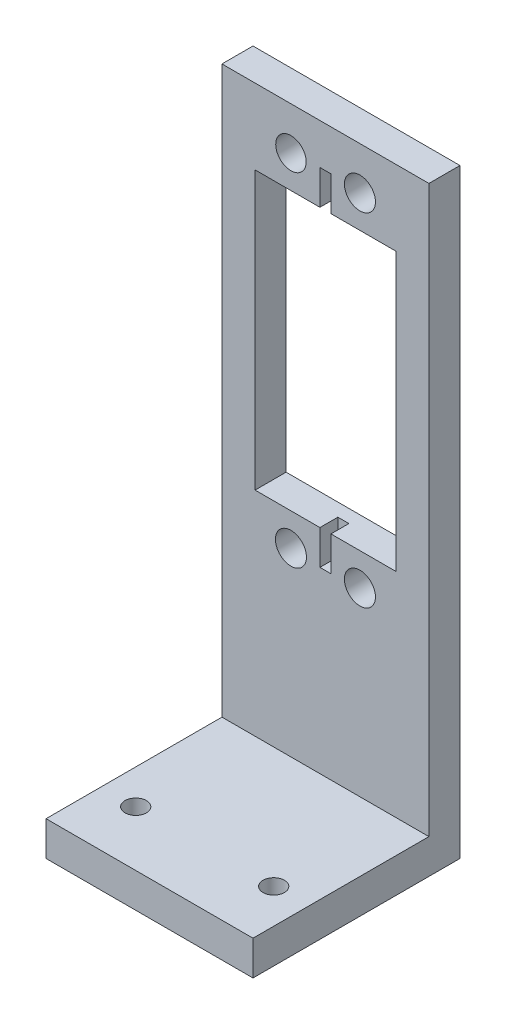
ISO-10303-21;
HEADER;
FILE_DESCRIPTION(('STEP AP214'),'2;1');
FILE_NAME('part.step','',(''),(''),'','','');
FILE_SCHEMA(('AUTOMOTIVE_DESIGN { 1 0 10303 214 1 1 1 1 }'));
ENDSEC;
DATA;
#1=APPLICATION_CONTEXT('core data for automotive mechanical design processes');
#2=APPLICATION_PROTOCOL_DEFINITION('international standard','automotive_design',2000,#1);
#3=PRODUCT_CONTEXT('',#1,'mechanical');
#4=PRODUCT('Part','Part','',(#3));
#5=PRODUCT_RELATED_PRODUCT_CATEGORY('part','',(#4));
#6=PRODUCT_DEFINITION_FORMATION('','',#4);
#7=PRODUCT_DEFINITION_CONTEXT('part definition',#1,'design');
#8=PRODUCT_DEFINITION('design','',#6,#7);
#9=PRODUCT_DEFINITION_SHAPE('','',#8);
#10=(LENGTH_UNIT() NAMED_UNIT(*) SI_UNIT(.MILLI.,.METRE.));
#11=(NAMED_UNIT(*) PLANE_ANGLE_UNIT() SI_UNIT($,.RADIAN.));
#12=(NAMED_UNIT(*) SI_UNIT($,.STERADIAN.) SOLID_ANGLE_UNIT());
#13=UNCERTAINTY_MEASURE_WITH_UNIT(LENGTH_MEASURE(1.E-05),#10,'distance_accuracy_value','');
#14=(GEOMETRIC_REPRESENTATION_CONTEXT(3) GLOBAL_UNCERTAINTY_ASSIGNED_CONTEXT((#13)) GLOBAL_UNIT_ASSIGNED_CONTEXT((#10,
#11,#12)) REPRESENTATION_CONTEXT('',''));
#15=CARTESIAN_POINT('',(0.,0.,0.));
#16=DIRECTION('',(0.,0.,1.));
#17=DIRECTION('',(1.,0.,0.));
#18=AXIS2_PLACEMENT_3D('',#15,#16,#17);
#19=CARTESIAN_POINT('',(0.,0.,4.5));
#20=DIRECTION('',(0.,0.,1.));
#21=DIRECTION('',(1.,0.,0.));
#22=AXIS2_PLACEMENT_3D('',#19,#20,#21);
#23=PLANE('',#22);
#24=DIRECTION('',(0.,-1.,0.));
#25=VECTOR('',#24,1.);
#26=CARTESIAN_POINT('',(-0.800000000000001,-25.1,4.5));
#27=LINE('',#26,#25);
#28=CARTESIAN_POINT('',(-0.800000000000001,-20.1,4.5));
#29=VERTEX_POINT('',#28);
#30=CARTESIAN_POINT('',(-0.800000000000001,-25.1,4.5));
#31=VERTEX_POINT('',#30);
#32=EDGE_CURVE('E178',#29,#31,#27,.T.);
#33=ORIENTED_EDGE('',*,*,#32,.F.);
#34=DIRECTION('',(1.,0.,0.));
#35=VECTOR('',#34,1.);
#36=CARTESIAN_POINT('',(10.2,-20.1,4.5));
#37=LINE('',#36,#35);
#38=CARTESIAN_POINT('',(-10.2,-20.1,4.5));
#39=VERTEX_POINT('',#38);
#40=EDGE_CURVE('E344',#39,#29,#37,.T.);
#41=ORIENTED_EDGE('',*,*,#40,.F.);
#42=DIRECTION('',(0.,-1.,0.));
#43=VECTOR('',#42,1.);
#44=CARTESIAN_POINT('',(-10.2,-20.1,4.5));
#45=LINE('',#44,#43);
#46=CARTESIAN_POINT('',(-10.2,20.1,4.5));
#47=VERTEX_POINT('',#46);
#48=EDGE_CURVE('E339',#47,#39,#45,.T.);
#49=ORIENTED_EDGE('',*,*,#48,.F.);
#50=DIRECTION('',(-1.,0.,0.));
#51=VECTOR('',#50,1.);
#52=CARTESIAN_POINT('',(10.2,20.1,4.5));
#53=LINE('',#52,#51);
#54=CARTESIAN_POINT('',(-0.800000000000001,20.1,4.5));
#55=VERTEX_POINT('',#54);
#56=EDGE_CURVE('E352',#55,#47,#53,.T.);
#57=ORIENTED_EDGE('',*,*,#56,.F.);
#58=DIRECTION('',(0.,-1.,0.));
#59=VECTOR('',#58,1.);
#60=CARTESIAN_POINT('',(-0.800000000000001,25.1,4.5));
#61=LINE('',#60,#59);
#62=CARTESIAN_POINT('',(-0.800000000000001,25.1,4.5));
#63=VERTEX_POINT('',#62);
#64=EDGE_CURVE('E233',#63,#55,#61,.T.);
#65=ORIENTED_EDGE('',*,*,#64,.F.);
#66=DIRECTION('',(-1.,0.,0.));
#67=VECTOR('',#66,1.);
#68=CARTESIAN_POINT('',(0.799999999999999,25.1,4.5));
#69=LINE('',#68,#67);
#70=CARTESIAN_POINT('',(0.799999999999999,25.1,4.5));
#71=VERTEX_POINT('',#70);
#72=EDGE_CURVE('E236',#71,#63,#69,.T.);
#73=ORIENTED_EDGE('',*,*,#72,.F.);
#74=DIRECTION('',(0.,1.,0.));
#75=VECTOR('',#74,1.);
#76=CARTESIAN_POINT('',(0.799999999999999,25.1,4.5));
#77=LINE('',#76,#75);
#78=CARTESIAN_POINT('',(0.799999999999999,20.1,4.5));
#79=VERTEX_POINT('',#78);
#80=EDGE_CURVE('E206',#79,#71,#77,.T.);
#81=ORIENTED_EDGE('',*,*,#80,.F.);
#82=CARTESIAN_POINT('',(10.2,20.1,4.5));
#83=VERTEX_POINT('',#82);
#84=EDGE_CURVE('E353',#83,#79,#53,.T.);
#85=ORIENTED_EDGE('',*,*,#84,.F.);
#86=DIRECTION('',(0.,1.,0.));
#87=VECTOR('',#86,1.);
#88=CARTESIAN_POINT('',(10.2,-20.1,4.5));
#89=LINE('',#88,#87);
#90=CARTESIAN_POINT('',(10.2,-20.1,4.5));
#91=VERTEX_POINT('',#90);
#92=EDGE_CURVE('E348',#91,#83,#89,.T.);
#93=ORIENTED_EDGE('',*,*,#92,.F.);
#94=CARTESIAN_POINT('',(0.799999999999999,-20.1,4.5));
#95=VERTEX_POINT('',#94);
#96=EDGE_CURVE('E342',#95,#91,#37,.T.);
#97=ORIENTED_EDGE('',*,*,#96,.F.);
#98=DIRECTION('',(0.,1.,0.));
#99=VECTOR('',#98,1.);
#100=CARTESIAN_POINT('',(0.799999999999999,-25.1,4.5));
#101=LINE('',#100,#99);
#102=CARTESIAN_POINT('',(0.799999999999999,-25.1,4.5));
#103=VERTEX_POINT('',#102);
#104=EDGE_CURVE('E194',#103,#95,#101,.T.);
#105=ORIENTED_EDGE('',*,*,#104,.F.);
#106=DIRECTION('',(1.,0.,0.));
#107=VECTOR('',#106,1.);
#108=CARTESIAN_POINT('',(0.799999999999999,-25.1,4.5));
#109=LINE('',#108,#107);
#110=EDGE_CURVE('E197',#31,#103,#109,.T.);
#111=ORIENTED_EDGE('',*,*,#110,.F.);
#112=EDGE_LOOP('',(#33,#41,#49,#57,#65,#73,#81,#85,#93,#97,#105,#111));
#113=FACE_BOUND('',#112,.T.);
#114=CARTESIAN_POINT('',(-5.,-24.8,4.5));
#115=DIRECTION('',(0.,0.,-1.));
#116=DIRECTION('',(-1.,0.,0.));
#117=AXIS2_PLACEMENT_3D('',#114,#115,#116);
#118=CIRCLE('',#117,2.25);
#119=CARTESIAN_POINT('',(-7.25,-24.8,4.5));
#120=VERTEX_POINT('',#119);
#121=EDGE_CURVE('E320',#120,#120,#118,.T.);
#122=ORIENTED_EDGE('',*,*,#121,.T.);
#123=EDGE_LOOP('',(#122));
#124=FACE_BOUND('',#123,.T.);
#125=CARTESIAN_POINT('',(5.,24.8,4.5));
#126=DIRECTION('',(0.,0.,-1.));
#127=DIRECTION('',(-1.,0.,0.));
#128=AXIS2_PLACEMENT_3D('',#125,#126,#127);
#129=CIRCLE('',#128,2.25);
#130=CARTESIAN_POINT('',(2.75,24.8,4.5));
#131=VERTEX_POINT('',#130);
#132=EDGE_CURVE('E311',#131,#131,#129,.T.);
#133=ORIENTED_EDGE('',*,*,#132,.T.);
#134=EDGE_LOOP('',(#133));
#135=FACE_BOUND('',#134,.T.);
#136=CARTESIAN_POINT('',(-5.,24.8,4.5));
#137=DIRECTION('',(0.,0.,-1.));
#138=DIRECTION('',(-1.,0.,0.));
#139=AXIS2_PLACEMENT_3D('',#136,#137,#138);
#140=CIRCLE('',#139,2.20649785974984);
#141=CARTESIAN_POINT('',(-7.20649785974984,24.8,4.5));
#142=VERTEX_POINT('',#141);
#143=EDGE_CURVE('E306',#142,#142,#140,.T.);
#144=ORIENTED_EDGE('',*,*,#143,.T.);
#145=EDGE_LOOP('',(#144));
#146=FACE_BOUND('',#145,.T.);
#147=CARTESIAN_POINT('',(5.,-24.8,4.5));
#148=DIRECTION('',(0.,0.,-1.));
#149=DIRECTION('',(-1.,0.,0.));
#150=AXIS2_PLACEMENT_3D('',#147,#148,#149);
#151=CIRCLE('',#150,2.25);
#152=CARTESIAN_POINT('',(2.75,-24.8,4.5));
#153=VERTEX_POINT('',#152);
#154=EDGE_CURVE('E331',#153,#153,#151,.T.);
#155=ORIENTED_EDGE('',*,*,#154,.T.);
#156=EDGE_LOOP('',(#155));
#157=FACE_BOUND('',#156,.T.);
#158=DIRECTION('',(0.,-1.,0.));
#159=VECTOR('',#158,1.);
#160=CARTESIAN_POINT('',(-15.,-31.,4.5));
#161=LINE('',#160,#159);
#162=CARTESIAN_POINT('',(-15.,31.,4.5));
#163=VERTEX_POINT('',#162);
#164=CARTESIAN_POINT('',(-15.,-51.,4.5));
#165=VERTEX_POINT('',#164);
#166=EDGE_CURVE('E386',#163,#165,#161,.T.);
#167=ORIENTED_EDGE('',*,*,#166,.T.);
#168=DIRECTION('',(-1.,0.,0.));
#169=VECTOR('',#168,1.);
#170=CARTESIAN_POINT('',(15.,-51.,4.5));
#171=LINE('',#170,#169);
#172=CARTESIAN_POINT('',(15.,-51.,4.5));
#173=VERTEX_POINT('',#172);
#174=EDGE_CURVE('E302',#173,#165,#171,.T.);
#175=ORIENTED_EDGE('',*,*,#174,.F.);
#176=DIRECTION('',(0.,1.,0.));
#177=VECTOR('',#176,1.);
#178=CARTESIAN_POINT('',(15.,-31.,4.5));
#179=LINE('',#178,#177);
#180=CARTESIAN_POINT('',(15.,31.,4.5));
#181=VERTEX_POINT('',#180);
#182=EDGE_CURVE('E389',#173,#181,#179,.T.);
#183=ORIENTED_EDGE('',*,*,#182,.T.);
#184=DIRECTION('',(-1.,0.,0.));
#185=VECTOR('',#184,1.);
#186=CARTESIAN_POINT('',(15.,31.,4.5));
#187=LINE('',#186,#185);
#188=EDGE_CURVE('E393',#181,#163,#187,.T.);
#189=ORIENTED_EDGE('',*,*,#188,.T.);
#190=EDGE_LOOP('',(#167,#175,#183,#189));
#191=FACE_BOUND('',#190,.T.);
#192=ADVANCED_FACE('F43',(#113,#124,#135,#146,#157,#191),#23,.T.);
#193=CARTESIAN_POINT('',(0.,0.,0.));
#194=DIRECTION('',(0.,0.,1.));
#195=DIRECTION('',(1.,0.,0.));
#196=AXIS2_PLACEMENT_3D('',#193,#194,#195);
#197=PLANE('',#196);
#198=CARTESIAN_POINT('',(-5.,-24.8,0.));
#199=DIRECTION('',(0.,0.,-1.));
#200=DIRECTION('',(-1.,0.,0.));
#201=AXIS2_PLACEMENT_3D('',#198,#199,#200);
#202=CIRCLE('',#201,2.25);
#203=CARTESIAN_POINT('',(-7.25,-24.8,0.));
#204=VERTEX_POINT('',#203);
#205=EDGE_CURVE('E315',#204,#204,#202,.T.);
#206=ORIENTED_EDGE('',*,*,#205,.F.);
#207=EDGE_LOOP('',(#206));
#208=FACE_BOUND('',#207,.T.);
#209=CARTESIAN_POINT('',(5.,24.8,0.));
#210=DIRECTION('',(0.,0.,-1.));
#211=DIRECTION('',(-1.,0.,0.));
#212=AXIS2_PLACEMENT_3D('',#209,#210,#211);
#213=CIRCLE('',#212,2.25);
#214=CARTESIAN_POINT('',(2.75,24.8,0.));
#215=VERTEX_POINT('',#214);
#216=EDGE_CURVE('E324',#215,#215,#213,.T.);
#217=ORIENTED_EDGE('',*,*,#216,.F.);
#218=EDGE_LOOP('',(#217));
#219=FACE_BOUND('',#218,.T.);
#220=CARTESIAN_POINT('',(-5.,24.8,0.));
#221=DIRECTION('',(0.,0.,-1.));
#222=DIRECTION('',(-1.,0.,0.));
#223=AXIS2_PLACEMENT_3D('',#220,#221,#222);
#224=CIRCLE('',#223,2.20649785974984);
#225=CARTESIAN_POINT('',(-7.20649785974984,24.8,0.));
#226=VERTEX_POINT('',#225);
#227=EDGE_CURVE('E307',#226,#226,#224,.T.);
#228=ORIENTED_EDGE('',*,*,#227,.F.);
#229=EDGE_LOOP('',(#228));
#230=FACE_BOUND('',#229,.T.);
#231=CARTESIAN_POINT('',(5.,-24.8,0.));
#232=DIRECTION('',(0.,0.,-1.));
#233=DIRECTION('',(-1.,0.,0.));
#234=AXIS2_PLACEMENT_3D('',#231,#232,#233);
#235=CIRCLE('',#234,2.25);
#236=CARTESIAN_POINT('',(2.75,-24.8,0.));
#237=VERTEX_POINT('',#236);
#238=EDGE_CURVE('E319',#237,#237,#235,.T.);
#239=ORIENTED_EDGE('',*,*,#238,.F.);
#240=EDGE_LOOP('',(#239));
#241=FACE_BOUND('',#240,.T.);
#242=DIRECTION('',(0.,-1.,0.));
#243=VECTOR('',#242,1.);
#244=CARTESIAN_POINT('',(-15.,-31.,0.));
#245=LINE('',#244,#243);
#246=CARTESIAN_POINT('',(-15.,31.,0.));
#247=VERTEX_POINT('',#246);
#248=CARTESIAN_POINT('',(-15.,-56.,0.));
#249=VERTEX_POINT('',#248);
#250=EDGE_CURVE('E385',#247,#249,#245,.T.);
#251=ORIENTED_EDGE('',*,*,#250,.F.);
#252=DIRECTION('',(-1.,0.,0.));
#253=VECTOR('',#252,1.);
#254=CARTESIAN_POINT('',(15.,31.,0.));
#255=LINE('',#254,#253);
#256=CARTESIAN_POINT('',(15.,31.,0.));
#257=VERTEX_POINT('',#256);
#258=EDGE_CURVE('E390',#257,#247,#255,.T.);
#259=ORIENTED_EDGE('',*,*,#258,.F.);
#260=DIRECTION('',(0.,1.,0.));
#261=VECTOR('',#260,1.);
#262=CARTESIAN_POINT('',(15.,-31.,0.));
#263=LINE('',#262,#261);
#264=CARTESIAN_POINT('',(15.,-56.,0.));
#265=VERTEX_POINT('',#264);
#266=EDGE_CURVE('E398',#265,#257,#263,.T.);
#267=ORIENTED_EDGE('',*,*,#266,.F.);
#268=DIRECTION('',(1.,0.,0.));
#269=VECTOR('',#268,1.);
#270=CARTESIAN_POINT('',(15.,-56.,0.));
#271=LINE('',#270,#269);
#272=EDGE_CURVE('E282',#249,#265,#271,.T.);
#273=ORIENTED_EDGE('',*,*,#272,.F.);
#274=EDGE_LOOP('',(#251,#259,#267,#273));
#275=FACE_BOUND('',#274,.T.);
#276=DIRECTION('',(0.,-1.,0.));
#277=VECTOR('',#276,1.);
#278=CARTESIAN_POINT('',(-10.2,-20.1,0.));
#279=LINE('',#278,#277);
#280=CARTESIAN_POINT('',(-10.2,20.1,0.));
#281=VERTEX_POINT('',#280);
#282=CARTESIAN_POINT('',(-10.2,-20.1,0.));
#283=VERTEX_POINT('',#282);
#284=EDGE_CURVE('E335',#281,#283,#279,.T.);
#285=ORIENTED_EDGE('',*,*,#284,.T.);
#286=DIRECTION('',(1.,0.,0.));
#287=VECTOR('',#286,1.);
#288=CARTESIAN_POINT('',(10.2,-20.1,0.));
#289=LINE('',#288,#287);
#290=CARTESIAN_POINT('',(10.2,-20.1,0.));
#291=VERTEX_POINT('',#290);
#292=EDGE_CURVE('E361',#283,#291,#289,.T.);
#293=ORIENTED_EDGE('',*,*,#292,.T.);
#294=DIRECTION('',(0.,1.,0.));
#295=VECTOR('',#294,1.);
#296=CARTESIAN_POINT('',(10.2,-20.1,0.));
#297=LINE('',#296,#295);
#298=CARTESIAN_POINT('',(10.2,20.1,0.));
#299=VERTEX_POINT('',#298);
#300=EDGE_CURVE('E365',#291,#299,#297,.T.);
#301=ORIENTED_EDGE('',*,*,#300,.T.);
#302=DIRECTION('',(-1.,0.,0.));
#303=VECTOR('',#302,1.);
#304=CARTESIAN_POINT('',(10.2,20.1,0.));
#305=LINE('',#304,#303);
#306=EDGE_CURVE('E343',#299,#281,#305,.T.);
#307=ORIENTED_EDGE('',*,*,#306,.T.);
#308=EDGE_LOOP('',(#285,#293,#301,#307));
#309=FACE_BOUND('',#308,.T.);
#310=ADVANCED_FACE('F414',(#208,#219,#230,#241,#275,#309),#197,.F.);
#311=CARTESIAN_POINT('',(-15.,-31.,4.5));
#312=DIRECTION('',(1.,0.,0.));
#313=DIRECTION('',(0.,0.,-1.));
#314=AXIS2_PLACEMENT_3D('',#311,#312,#313);
#315=PLANE('',#314);
#316=ORIENTED_EDGE('',*,*,#250,.T.);
#317=DIRECTION('',(0.,0.,-1.));
#318=VECTOR('',#317,1.);
#319=CARTESIAN_POINT('',(-15.,-56.,0.));
#320=LINE('',#319,#318);
#321=CARTESIAN_POINT('',(-15.,-56.,30.));
#322=VERTEX_POINT('',#321);
#323=EDGE_CURVE('E278',#322,#249,#320,.T.);
#324=ORIENTED_EDGE('',*,*,#323,.F.);
#325=DIRECTION('',(0.,1.,0.));
#326=VECTOR('',#325,1.);
#327=CARTESIAN_POINT('',(-15.,-56.,30.));
#328=LINE('',#327,#326);
#329=CARTESIAN_POINT('',(-15.,-51.,30.));
#330=VERTEX_POINT('',#329);
#331=EDGE_CURVE('E286',#322,#330,#328,.T.);
#332=ORIENTED_EDGE('',*,*,#331,.T.);
#333=DIRECTION('',(0.,0.,-1.));
#334=VECTOR('',#333,1.);
#335=CARTESIAN_POINT('',(-15.,-51.,0.));
#336=LINE('',#335,#334);
#337=EDGE_CURVE('E275',#330,#165,#336,.T.);
#338=ORIENTED_EDGE('',*,*,#337,.T.);
#339=ORIENTED_EDGE('',*,*,#166,.F.);
#340=DIRECTION('',(0.,0.,-1.));
#341=VECTOR('',#340,1.);
#342=CARTESIAN_POINT('',(-15.,31.,4.5));
#343=LINE('',#342,#341);
#344=EDGE_CURVE('E52',#163,#247,#343,.T.);
#345=ORIENTED_EDGE('',*,*,#344,.T.);
#346=EDGE_LOOP('',(#316,#324,#332,#338,#339,#345));
#347=FACE_BOUND('',#346,.T.);
#348=ADVANCED_FACE('F45',(#347),#315,.F.);
#349=CARTESIAN_POINT('',(15.,-31.,4.5));
#350=DIRECTION('',(-1.,0.,0.));
#351=DIRECTION('',(0.,0.,1.));
#352=AXIS2_PLACEMENT_3D('',#349,#350,#351);
#353=PLANE('',#352);
#354=ORIENTED_EDGE('',*,*,#266,.T.);
#355=DIRECTION('',(0.,0.,-1.));
#356=VECTOR('',#355,1.);
#357=CARTESIAN_POINT('',(15.,31.,4.5));
#358=LINE('',#357,#356);
#359=EDGE_CURVE('E11',#181,#257,#358,.T.);
#360=ORIENTED_EDGE('',*,*,#359,.F.);
#361=ORIENTED_EDGE('',*,*,#182,.F.);
#362=DIRECTION('',(0.,0.,1.));
#363=VECTOR('',#362,1.);
#364=CARTESIAN_POINT('',(15.,-51.,0.));
#365=LINE('',#364,#363);
#366=CARTESIAN_POINT('',(15.,-51.,30.));
#367=VERTEX_POINT('',#366);
#368=EDGE_CURVE('E269',#173,#367,#365,.T.);
#369=ORIENTED_EDGE('',*,*,#368,.T.);
#370=DIRECTION('',(0.,1.,0.));
#371=VECTOR('',#370,1.);
#372=CARTESIAN_POINT('',(15.,-56.,30.));
#373=LINE('',#372,#371);
#374=CARTESIAN_POINT('',(15.,-56.,30.));
#375=VERTEX_POINT('',#374);
#376=EDGE_CURVE('E298',#375,#367,#373,.T.);
#377=ORIENTED_EDGE('',*,*,#376,.F.);
#378=DIRECTION('',(0.,0.,1.));
#379=VECTOR('',#378,1.);
#380=CARTESIAN_POINT('',(15.,-56.,0.));
#381=LINE('',#380,#379);
#382=EDGE_CURVE('E270',#265,#375,#381,.T.);
#383=ORIENTED_EDGE('',*,*,#382,.F.);
#384=EDGE_LOOP('',(#354,#360,#361,#369,#377,#383));
#385=FACE_BOUND('',#384,.T.);
#386=ADVANCED_FACE('F421',(#385),#353,.F.);
#387=CARTESIAN_POINT('',(15.,31.,4.5));
#388=DIRECTION('',(0.,-1.,0.));
#389=DIRECTION('',(1.,0.,0.));
#390=AXIS2_PLACEMENT_3D('',#387,#388,#389);
#391=PLANE('',#390);
#392=ORIENTED_EDGE('',*,*,#258,.T.);
#393=ORIENTED_EDGE('',*,*,#344,.F.);
#394=ORIENTED_EDGE('',*,*,#188,.F.);
#395=ORIENTED_EDGE('',*,*,#359,.T.);
#396=EDGE_LOOP('',(#392,#393,#394,#395));
#397=FACE_BOUND('',#396,.T.);
#398=ADVANCED_FACE('F433',(#397),#391,.F.);
#399=CARTESIAN_POINT('',(-10.2,-20.1,4.5));
#400=DIRECTION('',(1.,0.,0.));
#401=DIRECTION('',(0.,0.,-1.));
#402=AXIS2_PLACEMENT_3D('',#399,#400,#401);
#403=PLANE('',#402);
#404=ORIENTED_EDGE('',*,*,#284,.F.);
#405=DIRECTION('',(0.,0.,-1.));
#406=VECTOR('',#405,1.);
#407=CARTESIAN_POINT('',(-10.2,20.1,4.5));
#408=LINE('',#407,#406);
#409=EDGE_CURVE('E357',#47,#281,#408,.T.);
#410=ORIENTED_EDGE('',*,*,#409,.F.);
#411=ORIENTED_EDGE('',*,*,#48,.T.);
#412=DIRECTION('',(0.,0.,-1.));
#413=VECTOR('',#412,1.);
#414=CARTESIAN_POINT('',(-10.2,-20.1,4.5));
#415=LINE('',#414,#413);
#416=EDGE_CURVE('E381',#39,#283,#415,.T.);
#417=ORIENTED_EDGE('',*,*,#416,.T.);
#418=EDGE_LOOP('',(#404,#410,#411,#417));
#419=FACE_BOUND('',#418,.T.);
#420=ADVANCED_FACE('F435',(#419),#403,.T.);
#421=CARTESIAN_POINT('',(10.2,-20.1,4.5));
#422=DIRECTION('',(0.,1.,0.));
#423=DIRECTION('',(0.,0.,1.));
#424=AXIS2_PLACEMENT_3D('',#421,#422,#423);
#425=PLANE('',#424);
#426=DIRECTION('',(0.,0.,1.));
#427=VECTOR('',#426,1.);
#428=CARTESIAN_POINT('',(-0.800000000000001,-20.1,1.9));
#429=LINE('',#428,#427);
#430=CARTESIAN_POINT('',(-0.800000000000001,-20.1,1.9));
#431=VERTEX_POINT('',#430);
#432=EDGE_CURVE('E209',#431,#29,#429,.T.);
#433=ORIENTED_EDGE('',*,*,#432,.F.);
#434=DIRECTION('',(-1.,0.,0.));
#435=VECTOR('',#434,1.);
#436=CARTESIAN_POINT('',(0.799999999999999,-20.1,1.9));
#437=LINE('',#436,#435);
#438=CARTESIAN_POINT('',(0.8,-20.1,1.9));
#439=VERTEX_POINT('',#438);
#440=EDGE_CURVE('E184',#439,#431,#437,.T.);
#441=ORIENTED_EDGE('',*,*,#440,.F.);
#442=DIRECTION('',(0.,0.,1.));
#443=VECTOR('',#442,1.);
#444=CARTESIAN_POINT('',(0.799999999999999,-20.1,1.9));
#445=LINE('',#444,#443);
#446=EDGE_CURVE('E213',#439,#95,#445,.T.);
#447=ORIENTED_EDGE('',*,*,#446,.T.);
#448=ORIENTED_EDGE('',*,*,#96,.T.);
#449=DIRECTION('',(0.,0.,-1.));
#450=VECTOR('',#449,1.);
#451=CARTESIAN_POINT('',(10.2,-20.1,4.5));
#452=LINE('',#451,#450);
#453=EDGE_CURVE('E378',#91,#291,#452,.T.);
#454=ORIENTED_EDGE('',*,*,#453,.T.);
#455=ORIENTED_EDGE('',*,*,#292,.F.);
#456=ORIENTED_EDGE('',*,*,#416,.F.);
#457=ORIENTED_EDGE('',*,*,#40,.T.);
#458=EDGE_LOOP('',(#433,#441,#447,#448,#454,#455,#456,#457));
#459=FACE_BOUND('',#458,.T.);
#460=ADVANCED_FACE('F441',(#459),#425,.T.);
#461=CARTESIAN_POINT('',(10.2,-20.1,4.5));
#462=DIRECTION('',(-1.,0.,0.));
#463=DIRECTION('',(0.,0.,1.));
#464=AXIS2_PLACEMENT_3D('',#461,#462,#463);
#465=PLANE('',#464);
#466=ORIENTED_EDGE('',*,*,#300,.F.);
#467=ORIENTED_EDGE('',*,*,#453,.F.);
#468=ORIENTED_EDGE('',*,*,#92,.T.);
#469=DIRECTION('',(0.,0.,-1.));
#470=VECTOR('',#469,1.);
#471=CARTESIAN_POINT('',(10.2,20.1,4.5));
#472=LINE('',#471,#470);
#473=EDGE_CURVE('E375',#83,#299,#472,.T.);
#474=ORIENTED_EDGE('',*,*,#473,.T.);
#475=EDGE_LOOP('',(#466,#467,#468,#474));
#476=FACE_BOUND('',#475,.T.);
#477=ADVANCED_FACE('F456',(#476),#465,.T.);
#478=CARTESIAN_POINT('',(10.2,20.1,4.5));
#479=DIRECTION('',(0.,-1.,0.));
#480=DIRECTION('',(0.,0.,-1.));
#481=AXIS2_PLACEMENT_3D('',#478,#479,#480);
#482=PLANE('',#481);
#483=DIRECTION('',(0.,0.,1.));
#484=VECTOR('',#483,1.);
#485=CARTESIAN_POINT('',(0.799999999999999,20.1,1.9));
#486=LINE('',#485,#484);
#487=CARTESIAN_POINT('',(0.799999999999999,20.1,1.9));
#488=VERTEX_POINT('',#487);
#489=EDGE_CURVE('E230',#488,#79,#486,.T.);
#490=ORIENTED_EDGE('',*,*,#489,.F.);
#491=DIRECTION('',(1.,0.,0.));
#492=VECTOR('',#491,1.);
#493=CARTESIAN_POINT('',(0.799999999999999,20.1,1.9));
#494=LINE('',#493,#492);
#495=CARTESIAN_POINT('',(-0.8,20.1,1.9));
#496=VERTEX_POINT('',#495);
#497=EDGE_CURVE('E222',#496,#488,#494,.T.);
#498=ORIENTED_EDGE('',*,*,#497,.F.);
#499=DIRECTION('',(0.,0.,1.));
#500=VECTOR('',#499,1.);
#501=CARTESIAN_POINT('',(-0.800000000000001,20.1,1.9));
#502=LINE('',#501,#500);
#503=EDGE_CURVE('E226',#496,#55,#502,.T.);
#504=ORIENTED_EDGE('',*,*,#503,.T.);
#505=ORIENTED_EDGE('',*,*,#56,.T.);
#506=ORIENTED_EDGE('',*,*,#409,.T.);
#507=ORIENTED_EDGE('',*,*,#306,.F.);
#508=ORIENTED_EDGE('',*,*,#473,.F.);
#509=ORIENTED_EDGE('',*,*,#84,.T.);
#510=EDGE_LOOP('',(#490,#498,#504,#505,#506,#507,#508,#509));
#511=FACE_BOUND('',#510,.T.);
#512=ADVANCED_FACE('F460',(#511),#482,.T.);
#513=CARTESIAN_POINT('',(5.,-24.8,4.5));
#514=DIRECTION('',(0.,0.,-1.));
#515=DIRECTION('',(-1.,0.,0.));
#516=AXIS2_PLACEMENT_3D('',#513,#514,#515);
#517=CYLINDRICAL_SURFACE('',#516,2.25);
#518=ORIENTED_EDGE('',*,*,#154,.F.);
#519=EDGE_LOOP('',(#518));
#520=FACE_BOUND('',#519,.T.);
#521=ORIENTED_EDGE('',*,*,#238,.T.);
#522=EDGE_LOOP('',(#521));
#523=FACE_BOUND('',#522,.T.);
#524=ADVANCED_FACE('F464',(#520,#523),#517,.F.);
#525=CARTESIAN_POINT('',(-5.,24.8,4.5));
#526=DIRECTION('',(0.,0.,-1.));
#527=DIRECTION('',(-1.,0.,0.));
#528=AXIS2_PLACEMENT_3D('',#525,#526,#527);
#529=CYLINDRICAL_SURFACE('',#528,2.20649785974984);
#530=ORIENTED_EDGE('',*,*,#143,.F.);
#531=EDGE_LOOP('',(#530));
#532=FACE_BOUND('',#531,.T.);
#533=ORIENTED_EDGE('',*,*,#227,.T.);
#534=EDGE_LOOP('',(#533));
#535=FACE_BOUND('',#534,.T.);
#536=ADVANCED_FACE('F468',(#532,#535),#529,.F.);
#537=CARTESIAN_POINT('',(5.,24.8,4.5));
#538=DIRECTION('',(0.,0.,-1.));
#539=DIRECTION('',(-1.,0.,0.));
#540=AXIS2_PLACEMENT_3D('',#537,#538,#539);
#541=CYLINDRICAL_SURFACE('',#540,2.25);
#542=ORIENTED_EDGE('',*,*,#132,.F.);
#543=EDGE_LOOP('',(#542));
#544=FACE_BOUND('',#543,.T.);
#545=ORIENTED_EDGE('',*,*,#216,.T.);
#546=EDGE_LOOP('',(#545));
#547=FACE_BOUND('',#546,.T.);
#548=ADVANCED_FACE('F470',(#544,#547),#541,.F.);
#549=CARTESIAN_POINT('',(-5.,-24.8,4.5));
#550=DIRECTION('',(0.,0.,-1.));
#551=DIRECTION('',(-1.,0.,0.));
#552=AXIS2_PLACEMENT_3D('',#549,#550,#551);
#553=CYLINDRICAL_SURFACE('',#552,2.25);
#554=ORIENTED_EDGE('',*,*,#121,.F.);
#555=EDGE_LOOP('',(#554));
#556=FACE_BOUND('',#555,.T.);
#557=ORIENTED_EDGE('',*,*,#205,.T.);
#558=EDGE_LOOP('',(#557));
#559=FACE_BOUND('',#558,.T.);
#560=ADVANCED_FACE('F473',(#556,#559),#553,.F.);
#561=CARTESIAN_POINT('',(0.,-51.,0.));
#562=DIRECTION('',(0.,-1.,0.));
#563=DIRECTION('',(0.,0.,-1.));
#564=AXIS2_PLACEMENT_3D('',#561,#562,#563);
#565=PLANE('',#564);
#566=CARTESIAN_POINT('',(10.,-51.,22.));
#567=DIRECTION('',(0.,-1.,0.));
#568=DIRECTION('',(0.,0.,-1.));
#569=AXIS2_PLACEMENT_3D('',#566,#567,#568);
#570=CIRCLE('',#569,1.55);
#571=CARTESIAN_POINT('',(10.,-51.,20.45));
#572=VERTEX_POINT('',#571);
#573=EDGE_CURVE('E265',#572,#572,#570,.T.);
#574=ORIENTED_EDGE('',*,*,#573,.T.);
#575=EDGE_LOOP('',(#574));
#576=FACE_BOUND('',#575,.T.);
#577=CARTESIAN_POINT('',(-10.,-51.,22.));
#578=DIRECTION('',(0.,-1.,0.));
#579=DIRECTION('',(0.,0.,-1.));
#580=AXIS2_PLACEMENT_3D('',#577,#578,#579);
#581=CIRCLE('',#580,1.55);
#582=CARTESIAN_POINT('',(-10.,-51.,20.45));
#583=VERTEX_POINT('',#582);
#584=EDGE_CURVE('E258',#583,#583,#581,.T.);
#585=ORIENTED_EDGE('',*,*,#584,.T.);
#586=EDGE_LOOP('',(#585));
#587=FACE_BOUND('',#586,.T.);
#588=ORIENTED_EDGE('',*,*,#368,.F.);
#589=ORIENTED_EDGE('',*,*,#174,.T.);
#590=ORIENTED_EDGE('',*,*,#337,.F.);
#591=DIRECTION('',(-1.,0.,0.));
#592=VECTOR('',#591,1.);
#593=CARTESIAN_POINT('',(15.,-51.,30.));
#594=LINE('',#593,#592);
#595=EDGE_CURVE('E289',#367,#330,#594,.T.);
#596=ORIENTED_EDGE('',*,*,#595,.F.);
#597=EDGE_LOOP('',(#588,#589,#590,#596));
#598=FACE_BOUND('',#597,.T.);
#599=ADVANCED_FACE('F430',(#576,#587,#598),#565,.F.);
#600=CARTESIAN_POINT('',(15.,-56.,30.));
#601=DIRECTION('',(0.,0.,-1.));
#602=DIRECTION('',(-1.,0.,0.));
#603=AXIS2_PLACEMENT_3D('',#600,#601,#602);
#604=PLANE('',#603);
#605=ORIENTED_EDGE('',*,*,#595,.T.);
#606=ORIENTED_EDGE('',*,*,#331,.F.);
#607=DIRECTION('',(-1.,0.,0.));
#608=VECTOR('',#607,1.);
#609=CARTESIAN_POINT('',(15.,-56.,30.));
#610=LINE('',#609,#608);
#611=EDGE_CURVE('E274',#375,#322,#610,.T.);
#612=ORIENTED_EDGE('',*,*,#611,.F.);
#613=ORIENTED_EDGE('',*,*,#376,.T.);
#614=EDGE_LOOP('',(#605,#606,#612,#613));
#615=FACE_BOUND('',#614,.T.);
#616=ADVANCED_FACE('F426',(#615),#604,.F.);
#617=CARTESIAN_POINT('',(0.,-56.,0.));
#618=DIRECTION('',(0.,-1.,0.));
#619=DIRECTION('',(0.,0.,-1.));
#620=AXIS2_PLACEMENT_3D('',#617,#618,#619);
#621=PLANE('',#620);
#622=CARTESIAN_POINT('',(10.,-56.,22.));
#623=DIRECTION('',(0.,-1.,0.));
#624=DIRECTION('',(0.,0.,-1.));
#625=AXIS2_PLACEMENT_3D('',#622,#623,#624);
#626=CIRCLE('',#625,1.55);
#627=CARTESIAN_POINT('',(10.,-56.,20.45));
#628=VERTEX_POINT('',#627);
#629=EDGE_CURVE('E254',#628,#628,#626,.T.);
#630=ORIENTED_EDGE('',*,*,#629,.F.);
#631=EDGE_LOOP('',(#630));
#632=FACE_BOUND('',#631,.T.);
#633=CARTESIAN_POINT('',(-10.,-56.,22.));
#634=DIRECTION('',(0.,-1.,0.));
#635=DIRECTION('',(0.,0.,1.));
#636=AXIS2_PLACEMENT_3D('',#633,#634,#635);
#637=CIRCLE('',#636,1.55);
#638=CARTESIAN_POINT('',(-10.,-56.,23.55));
#639=VERTEX_POINT('',#638);
#640=EDGE_CURVE('E212',#639,#639,#637,.T.);
#641=ORIENTED_EDGE('',*,*,#640,.F.);
#642=EDGE_LOOP('',(#641));
#643=FACE_BOUND('',#642,.T.);
#644=ORIENTED_EDGE('',*,*,#382,.T.);
#645=ORIENTED_EDGE('',*,*,#611,.T.);
#646=ORIENTED_EDGE('',*,*,#323,.T.);
#647=ORIENTED_EDGE('',*,*,#272,.T.);
#648=EDGE_LOOP('',(#644,#645,#646,#647));
#649=FACE_BOUND('',#648,.T.);
#650=ADVANCED_FACE('F418',(#632,#643,#649),#621,.T.);
#651=CARTESIAN_POINT('',(-10.,31.,22.));
#652=DIRECTION('',(0.,-1.,0.));
#653=DIRECTION('',(0.,0.,-1.));
#654=AXIS2_PLACEMENT_3D('',#651,#652,#653);
#655=CYLINDRICAL_SURFACE('',#654,1.55);
#656=ORIENTED_EDGE('',*,*,#640,.T.);
#657=EDGE_LOOP('',(#656));
#658=FACE_BOUND('',#657,.T.);
#659=ORIENTED_EDGE('',*,*,#584,.F.);
#660=EDGE_LOOP('',(#659));
#661=FACE_BOUND('',#660,.T.);
#662=ADVANCED_FACE('F488',(#658,#661),#655,.F.);
#663=CARTESIAN_POINT('',(10.,31.,22.));
#664=DIRECTION('',(0.,-1.,0.));
#665=DIRECTION('',(0.,0.,-1.));
#666=AXIS2_PLACEMENT_3D('',#663,#664,#665);
#667=CYLINDRICAL_SURFACE('',#666,1.55);
#668=ORIENTED_EDGE('',*,*,#629,.T.);
#669=EDGE_LOOP('',(#668));
#670=FACE_BOUND('',#669,.T.);
#671=ORIENTED_EDGE('',*,*,#573,.F.);
#672=EDGE_LOOP('',(#671));
#673=FACE_BOUND('',#672,.T.);
#674=ADVANCED_FACE('F492',(#670,#673),#667,.F.);
#675=CARTESIAN_POINT('',(0.799999999999999,25.1,1.9));
#676=DIRECTION('',(1.,0.,0.));
#677=DIRECTION('',(0.,0.,-1.));
#678=AXIS2_PLACEMENT_3D('',#675,#676,#677);
#679=PLANE('',#678);
#680=ORIENTED_EDGE('',*,*,#80,.T.);
#681=DIRECTION('',(0.,0.,1.));
#682=VECTOR('',#681,1.);
#683=CARTESIAN_POINT('',(0.799999999999999,25.1,1.9));
#684=LINE('',#683,#682);
#685=CARTESIAN_POINT('',(0.799999999999999,25.1,1.9));
#686=VERTEX_POINT('',#685);
#687=EDGE_CURVE('E219',#686,#71,#684,.T.);
#688=ORIENTED_EDGE('',*,*,#687,.F.);
#689=DIRECTION('',(0.,1.,0.));
#690=VECTOR('',#689,1.);
#691=CARTESIAN_POINT('',(0.799999999999999,25.1,1.9));
#692=LINE('',#691,#690);
#693=EDGE_CURVE('E237',#488,#686,#692,.T.);
#694=ORIENTED_EDGE('',*,*,#693,.F.);
#695=ORIENTED_EDGE('',*,*,#489,.T.);
#696=EDGE_LOOP('',(#680,#688,#694,#695));
#697=FACE_BOUND('',#696,.T.);
#698=ADVANCED_FACE('F496',(#697),#679,.F.);
#699=CARTESIAN_POINT('',(-0.800000000000001,25.1,1.9));
#700=DIRECTION('',(-1.,0.,0.));
#701=DIRECTION('',(0.,0.,1.));
#702=AXIS2_PLACEMENT_3D('',#699,#700,#701);
#703=PLANE('',#702);
#704=ORIENTED_EDGE('',*,*,#64,.T.);
#705=ORIENTED_EDGE('',*,*,#503,.F.);
#706=DIRECTION('',(0.,-1.,0.));
#707=VECTOR('',#706,1.);
#708=CARTESIAN_POINT('',(-0.800000000000001,25.1,1.9));
#709=LINE('',#708,#707);
#710=CARTESIAN_POINT('',(-0.800000000000001,25.1,1.9));
#711=VERTEX_POINT('',#710);
#712=EDGE_CURVE('E67',#711,#496,#709,.T.);
#713=ORIENTED_EDGE('',*,*,#712,.F.);
#714=DIRECTION('',(0.,0.,1.));
#715=VECTOR('',#714,1.);
#716=CARTESIAN_POINT('',(-0.800000000000001,25.1,1.9));
#717=LINE('',#716,#715);
#718=EDGE_CURVE('E223',#711,#63,#717,.T.);
#719=ORIENTED_EDGE('',*,*,#718,.T.);
#720=EDGE_LOOP('',(#704,#705,#713,#719));
#721=FACE_BOUND('',#720,.T.);
#722=ADVANCED_FACE('F502',(#721),#703,.F.);
#723=CARTESIAN_POINT('',(0.799999999999999,25.1,1.9));
#724=DIRECTION('',(0.,1.,0.));
#725=DIRECTION('',(0.,0.,1.));
#726=AXIS2_PLACEMENT_3D('',#723,#724,#725);
#727=PLANE('',#726);
#728=ORIENTED_EDGE('',*,*,#72,.T.);
#729=ORIENTED_EDGE('',*,*,#718,.F.);
#730=DIRECTION('',(-1.,0.,0.));
#731=VECTOR('',#730,1.);
#732=CARTESIAN_POINT('',(0.799999999999999,25.1,1.9));
#733=LINE('',#732,#731);
#734=EDGE_CURVE('E248',#686,#711,#733,.T.);
#735=ORIENTED_EDGE('',*,*,#734,.F.);
#736=ORIENTED_EDGE('',*,*,#687,.T.);
#737=EDGE_LOOP('',(#728,#729,#735,#736));
#738=FACE_BOUND('',#737,.T.);
#739=ADVANCED_FACE('F501',(#738),#727,.F.);
#740=CARTESIAN_POINT('',(0.,0.,1.9));
#741=DIRECTION('',(0.,0.,-1.));
#742=DIRECTION('',(-1.,0.,0.));
#743=AXIS2_PLACEMENT_3D('',#740,#741,#742);
#744=PLANE('',#743);
#745=ORIENTED_EDGE('',*,*,#693,.T.);
#746=ORIENTED_EDGE('',*,*,#734,.T.);
#747=ORIENTED_EDGE('',*,*,#712,.T.);
#748=ORIENTED_EDGE('',*,*,#497,.T.);
#749=EDGE_LOOP('',(#745,#746,#747,#748));
#750=FACE_BOUND('',#749,.T.);
#751=ADVANCED_FACE('F498',(#750),#744,.F.);
#752=CARTESIAN_POINT('',(-0.800000000000001,-25.1,1.9));
#753=DIRECTION('',(-1.,0.,0.));
#754=DIRECTION('',(0.,0.,1.));
#755=AXIS2_PLACEMENT_3D('',#752,#753,#754);
#756=PLANE('',#755);
#757=ORIENTED_EDGE('',*,*,#32,.T.);
#758=DIRECTION('',(0.,0.,1.));
#759=VECTOR('',#758,1.);
#760=CARTESIAN_POINT('',(-0.800000000000001,-25.1,1.9));
#761=LINE('',#760,#759);
#762=CARTESIAN_POINT('',(-0.800000000000001,-25.1,1.9));
#763=VERTEX_POINT('',#762);
#764=EDGE_CURVE('E172',#763,#31,#761,.T.);
#765=ORIENTED_EDGE('',*,*,#764,.F.);
#766=DIRECTION('',(0.,-1.,0.));
#767=VECTOR('',#766,1.);
#768=CARTESIAN_POINT('',(-0.800000000000001,-25.1,1.9));
#769=LINE('',#768,#767);
#770=EDGE_CURVE('E176',#431,#763,#769,.T.);
#771=ORIENTED_EDGE('',*,*,#770,.F.);
#772=ORIENTED_EDGE('',*,*,#432,.T.);
#773=EDGE_LOOP('',(#757,#765,#771,#772));
#774=FACE_BOUND('',#773,.T.);
#775=ADVANCED_FACE('F174',(#774),#756,.F.);
#776=CARTESIAN_POINT('',(0.799999999999999,-25.1,1.9));
#777=DIRECTION('',(1.,0.,0.));
#778=DIRECTION('',(0.,0.,-1.));
#779=AXIS2_PLACEMENT_3D('',#776,#777,#778);
#780=PLANE('',#779);
#781=ORIENTED_EDGE('',*,*,#104,.T.);
#782=ORIENTED_EDGE('',*,*,#446,.F.);
#783=DIRECTION('',(0.,1.,0.));
#784=VECTOR('',#783,1.);
#785=CARTESIAN_POINT('',(0.799999999999999,-25.1,1.9));
#786=LINE('',#785,#784);
#787=CARTESIAN_POINT('',(0.799999999999999,-25.1,1.9));
#788=VERTEX_POINT('',#787);
#789=EDGE_CURVE('E59',#788,#439,#786,.T.);
#790=ORIENTED_EDGE('',*,*,#789,.F.);
#791=DIRECTION('',(0.,0.,1.));
#792=VECTOR('',#791,1.);
#793=CARTESIAN_POINT('',(0.799999999999999,-25.1,1.9));
#794=LINE('',#793,#792);
#795=EDGE_CURVE('E183',#788,#103,#794,.T.);
#796=ORIENTED_EDGE('',*,*,#795,.T.);
#797=EDGE_LOOP('',(#781,#782,#790,#796));
#798=FACE_BOUND('',#797,.T.);
#799=ADVANCED_FACE('F514',(#798),#780,.F.);
#800=CARTESIAN_POINT('',(0.799999999999999,-25.1,1.9));
#801=DIRECTION('',(0.,-1.,0.));
#802=DIRECTION('',(0.,0.,-1.));
#803=AXIS2_PLACEMENT_3D('',#800,#801,#802);
#804=PLANE('',#803);
#805=ORIENTED_EDGE('',*,*,#110,.T.);
#806=ORIENTED_EDGE('',*,*,#795,.F.);
#807=DIRECTION('',(1.,0.,0.));
#808=VECTOR('',#807,1.);
#809=CARTESIAN_POINT('',(0.799999999999999,-25.1,1.9));
#810=LINE('',#809,#808);
#811=EDGE_CURVE('E186',#763,#788,#810,.T.);
#812=ORIENTED_EDGE('',*,*,#811,.F.);
#813=ORIENTED_EDGE('',*,*,#764,.T.);
#814=EDGE_LOOP('',(#805,#806,#812,#813));
#815=FACE_BOUND('',#814,.T.);
#816=ADVANCED_FACE('F187',(#815),#804,.F.);
#817=CARTESIAN_POINT('',(0.,0.,1.9));
#818=DIRECTION('',(0.,0.,1.));
#819=DIRECTION('',(1.,0.,0.));
#820=AXIS2_PLACEMENT_3D('',#817,#818,#819);
#821=PLANE('',#820);
#822=ORIENTED_EDGE('',*,*,#770,.T.);
#823=ORIENTED_EDGE('',*,*,#811,.T.);
#824=ORIENTED_EDGE('',*,*,#789,.T.);
#825=ORIENTED_EDGE('',*,*,#440,.T.);
#826=EDGE_LOOP('',(#822,#823,#824,#825));
#827=FACE_BOUND('',#826,.T.);
#828=ADVANCED_FACE('F190',(#827),#821,.T.);
#829=CLOSED_SHELL('',(#192,#310,#348,#386,#398,#420,#460,#477,#512,#524,#536,#548,#560,#599,
#616,#650,#662,#674,#698,#722,#739,#751,#775,#799,#816,#828));
#830=MANIFOLD_SOLID_BREP('B2',#829);
#831=ADVANCED_BREP_SHAPE_REPRESENTATION('',(#18,#830),#14);
#832=SHAPE_DEFINITION_REPRESENTATION(#9,#831);
ENDSEC;
END-ISO-10303-21;
